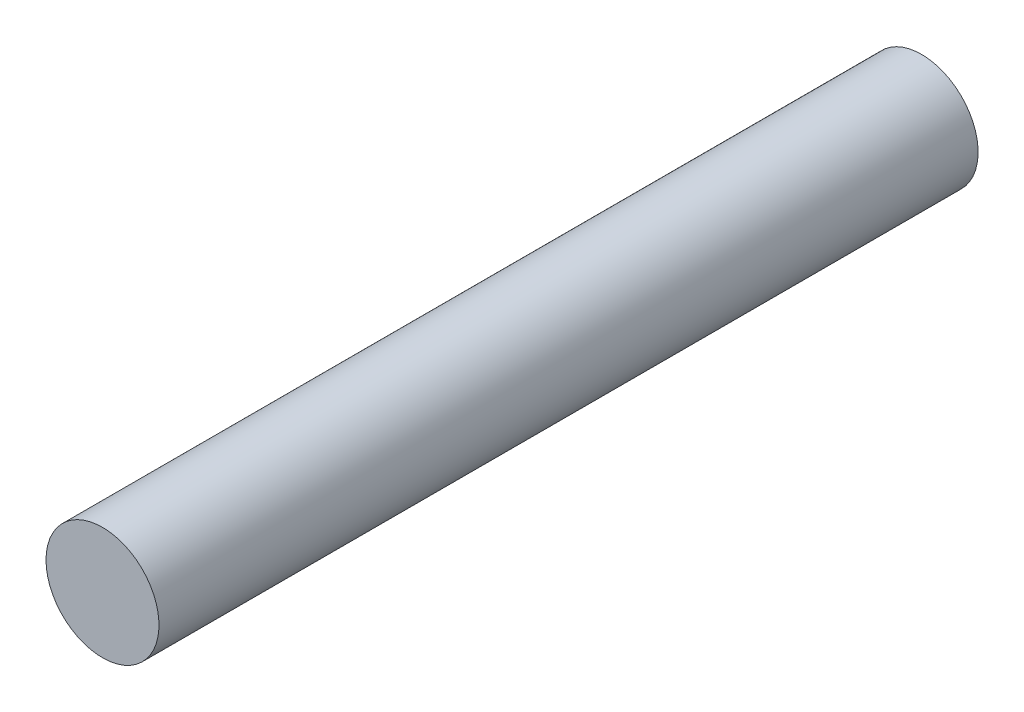
ISO-10303-21;
HEADER;
FILE_DESCRIPTION(('STEP AP214'),'2;1');
FILE_NAME('part.step','',(''),(''),'','','');
FILE_SCHEMA(('AUTOMOTIVE_DESIGN { 1 0 10303 214 1 1 1 1 }'));
ENDSEC;
DATA;
#1=APPLICATION_CONTEXT('core data for automotive mechanical design processes');
#2=APPLICATION_PROTOCOL_DEFINITION('international standard','automotive_design',2000,#1);
#3=PRODUCT_CONTEXT('',#1,'mechanical');
#4=PRODUCT('Part','Part','',(#3));
#5=PRODUCT_RELATED_PRODUCT_CATEGORY('part','',(#4));
#6=PRODUCT_DEFINITION_FORMATION('','',#4);
#7=PRODUCT_DEFINITION_CONTEXT('part definition',#1,'design');
#8=PRODUCT_DEFINITION('design','',#6,#7);
#9=PRODUCT_DEFINITION_SHAPE('','',#8);
#10=(LENGTH_UNIT() NAMED_UNIT(*) SI_UNIT(.MILLI.,.METRE.));
#11=(NAMED_UNIT(*) PLANE_ANGLE_UNIT() SI_UNIT($,.RADIAN.));
#12=(NAMED_UNIT(*) SI_UNIT($,.STERADIAN.) SOLID_ANGLE_UNIT());
#13=UNCERTAINTY_MEASURE_WITH_UNIT(LENGTH_MEASURE(1.E-05),#10,'distance_accuracy_value','');
#14=(GEOMETRIC_REPRESENTATION_CONTEXT(3) GLOBAL_UNCERTAINTY_ASSIGNED_CONTEXT((#13)) GLOBAL_UNIT_ASSIGNED_CONTEXT((#10,
#11,#12)) REPRESENTATION_CONTEXT('',''));
#15=CARTESIAN_POINT('',(0.,0.,0.));
#16=DIRECTION('',(0.,0.,1.));
#17=DIRECTION('',(1.,0.,0.));
#18=AXIS2_PLACEMENT_3D('',#15,#16,#17);
#19=CARTESIAN_POINT('',(0.,0.,58.));
#20=DIRECTION('',(0.,0.,-1.));
#21=DIRECTION('',(-1.,0.,0.));
#22=AXIS2_PLACEMENT_3D('',#19,#20,#21);
#23=CYLINDRICAL_SURFACE('',#22,4.);
#24=CARTESIAN_POINT('',(0.,0.,58.));
#25=DIRECTION('',(0.,0.,1.));
#26=DIRECTION('',(1.,0.,0.));
#27=AXIS2_PLACEMENT_3D('',#24,#25,#26);
#28=CIRCLE('',#27,4.);
#29=CARTESIAN_POINT('',(-4.,0.,58.));
#30=VERTEX_POINT('',#29);
#31=EDGE_CURVE('E10',#30,#30,#28,.T.);
#32=CARTESIAN_POINT('',(0.,0.,0.));
#33=DIRECTION('',(0.,0.,1.));
#34=DIRECTION('',(1.,0.,0.));
#35=AXIS2_PLACEMENT_3D('',#32,#33,#34);
#36=CIRCLE('',#35,4.);
#37=CARTESIAN_POINT('',(-4.,0.,0.));
#38=VERTEX_POINT('',#37);
#39=EDGE_CURVE('E34',#38,#38,#36,.T.);
#40=CARTESIAN_POINT('',(-4.,0.,58.));
#41=CARTESIAN_POINT('',(-4.,0.,57.3958333333333));
#42=CARTESIAN_POINT('',(-4.,0.,56.7916666666667));
#43=CARTESIAN_POINT('',(-4.,0.,55.5833333333333));
#44=CARTESIAN_POINT('',(-4.,0.,54.9791666666667));
#45=CARTESIAN_POINT('',(-4.,0.,53.7708333333333));
#46=CARTESIAN_POINT('',(-4.,0.,53.1666666666667));
#47=CARTESIAN_POINT('',(-4.,0.,51.9583333333333));
#48=CARTESIAN_POINT('',(-4.,0.,51.3541666666667));
#49=CARTESIAN_POINT('',(-4.,0.,50.1458333333333));
#50=CARTESIAN_POINT('',(-4.,0.,49.5416666666667));
#51=CARTESIAN_POINT('',(-4.,0.,48.3333333333333));
#52=CARTESIAN_POINT('',(-4.,0.,47.7291666666667));
#53=CARTESIAN_POINT('',(-4.,0.,46.5208333333333));
#54=CARTESIAN_POINT('',(-4.,0.,45.9166666666667));
#55=CARTESIAN_POINT('',(-4.,0.,44.7083333333333));
#56=CARTESIAN_POINT('',(-4.,0.,44.1041666666667));
#57=CARTESIAN_POINT('',(-4.,0.,42.8958333333333));
#58=CARTESIAN_POINT('',(-4.,0.,42.2916666666667));
#59=CARTESIAN_POINT('',(-4.,0.,41.0833333333333));
#60=CARTESIAN_POINT('',(-4.,0.,40.4791666666667));
#61=CARTESIAN_POINT('',(-4.,0.,39.2708333333333));
#62=CARTESIAN_POINT('',(-4.,0.,38.6666666666667));
#63=CARTESIAN_POINT('',(-4.,0.,37.4583333333333));
#64=CARTESIAN_POINT('',(-4.,0.,36.8541666666667));
#65=CARTESIAN_POINT('',(-4.,0.,35.6458333333333));
#66=CARTESIAN_POINT('',(-4.,0.,35.0416666666667));
#67=CARTESIAN_POINT('',(-4.,0.,33.8333333333333));
#68=CARTESIAN_POINT('',(-4.,0.,33.2291666666667));
#69=CARTESIAN_POINT('',(-4.,0.,32.0208333333333));
#70=CARTESIAN_POINT('',(-4.,0.,31.4166666666667));
#71=CARTESIAN_POINT('',(-4.,0.,30.2083333333333));
#72=CARTESIAN_POINT('',(-4.,0.,29.6041666666667));
#73=CARTESIAN_POINT('',(-4.,0.,28.3958333333333));
#74=CARTESIAN_POINT('',(-4.,0.,27.7916666666667));
#75=CARTESIAN_POINT('',(-4.,0.,26.5833333333333));
#76=CARTESIAN_POINT('',(-4.,0.,25.9791666666667));
#77=CARTESIAN_POINT('',(-4.,0.,24.7708333333333));
#78=CARTESIAN_POINT('',(-4.,0.,24.1666666666667));
#79=CARTESIAN_POINT('',(-4.,0.,22.9583333333333));
#80=CARTESIAN_POINT('',(-4.,0.,22.3541666666667));
#81=CARTESIAN_POINT('',(-4.,0.,21.1458333333333));
#82=CARTESIAN_POINT('',(-4.,0.,20.5416666666667));
#83=CARTESIAN_POINT('',(-4.,0.,19.3333333333333));
#84=CARTESIAN_POINT('',(-4.,0.,18.7291666666667));
#85=CARTESIAN_POINT('',(-4.,0.,17.5208333333333));
#86=CARTESIAN_POINT('',(-4.,0.,16.9166666666667));
#87=CARTESIAN_POINT('',(-4.,0.,15.7083333333333));
#88=CARTESIAN_POINT('',(-4.,0.,15.1041666666667));
#89=CARTESIAN_POINT('',(-4.,0.,13.8958333333333));
#90=CARTESIAN_POINT('',(-4.,0.,13.2916666666667));
#91=CARTESIAN_POINT('',(-4.,0.,12.0833333333333));
#92=CARTESIAN_POINT('',(-4.,0.,11.4791666666667));
#93=CARTESIAN_POINT('',(-4.,0.,10.2708333333333));
#94=CARTESIAN_POINT('',(-4.,0.,9.66666666666667));
#95=CARTESIAN_POINT('',(-4.,0.,8.45833333333333));
#96=CARTESIAN_POINT('',(-4.,0.,7.85416666666667));
#97=CARTESIAN_POINT('',(-4.,0.,6.64583333333333));
#98=CARTESIAN_POINT('',(-4.,0.,6.04166666666667));
#99=CARTESIAN_POINT('',(-4.,0.,4.83333333333333));
#100=CARTESIAN_POINT('',(-4.,0.,4.22916666666667));
#101=CARTESIAN_POINT('',(-4.,0.,3.02083333333334));
#102=CARTESIAN_POINT('',(-4.,0.,2.41666666666667));
#103=CARTESIAN_POINT('',(-4.,0.,1.20833333333333));
#104=CARTESIAN_POINT('',(-4.,0.,0.604166666666666));
#105=CARTESIAN_POINT('',(-4.,0.,0.));
#106=B_SPLINE_CURVE_WITH_KNOTS('',3,(#40,#41,#42,#43,#44,#45,#46,#47,#48,#49,#50,#51,#52,#53,
#54,#55,#56,#57,#58,#59,#60,#61,#62,#63,#64,#65,#66,#67,#68,#69,#70,#71,#72,#73,#74,#75,#76,#77,
#78,#79,#80,#81,#82,#83,#84,#85,#86,#87,#88,#89,#90,#91,#92,#93,#94,#95,#96,#97,#98,#99,#100,
#101,#102,#103,#104,#105),.UNSPECIFIED.,.F.,.F.,(4,2,2,2,2,2,2,2,2,2,2,2,2,2,2,2,2,2,2,2,2,2,2,
2,2,2,2,2,2,2,2,2,4),(0.,1.81249999999999,3.625,5.4375,7.24999999999999,9.06249999999999,10.875,
12.6875,14.5,16.3125,18.125,19.9375,21.75,23.5625,25.375,27.1875,29.,30.8125,32.625,34.4375,
36.25,38.0625,39.875,41.6875,43.5,45.3125,47.125,48.9375,50.75,52.5625,54.375,56.1875,58.),.UNSPECIFIED.);
#107=EDGE_CURVE('BSEAM31',#30,#38,#106,.T.);
#108=ORIENTED_EDGE('',*,*,#31,.F.);
#109=ORIENTED_EDGE('',*,*,#39,.T.);
#110=ORIENTED_EDGE('',*,*,#107,.T.);
#111=ORIENTED_EDGE('',*,*,#107,.F.);
#112=EDGE_LOOP('',(#108,#110,#109,#111));
#113=FACE_BOUND('',#112,.T.);
#114=ADVANCED_FACE('F31',(#113),#23,.T.);
#115=CARTESIAN_POINT('',(0.,0.,58.));
#116=DIRECTION('',(0.,0.,1.));
#117=DIRECTION('',(1.,0.,0.));
#118=AXIS2_PLACEMENT_3D('',#115,#116,#117);
#119=PLANE('',#118);
#120=ORIENTED_EDGE('',*,*,#31,.T.);
#121=EDGE_LOOP('',(#120));
#122=FACE_BOUND('',#121,.T.);
#123=ADVANCED_FACE('F46',(#122),#119,.T.);
#124=CARTESIAN_POINT('',(0.,0.,0.));
#125=DIRECTION('',(0.,0.,1.));
#126=DIRECTION('',(1.,0.,0.));
#127=AXIS2_PLACEMENT_3D('',#124,#125,#126);
#128=PLANE('',#127);
#129=ORIENTED_EDGE('',*,*,#39,.F.);
#130=EDGE_LOOP('',(#129));
#131=FACE_BOUND('',#130,.T.);
#132=ADVANCED_FACE('F44',(#131),#128,.F.);
#133=CLOSED_SHELL('',(#114,#123,#132));
#134=MANIFOLD_SOLID_BREP('B2',#133);
#135=ADVANCED_BREP_SHAPE_REPRESENTATION('',(#18,#134),#14);
#136=SHAPE_DEFINITION_REPRESENTATION(#9,#135);
ENDSEC;
END-ISO-10303-21;
